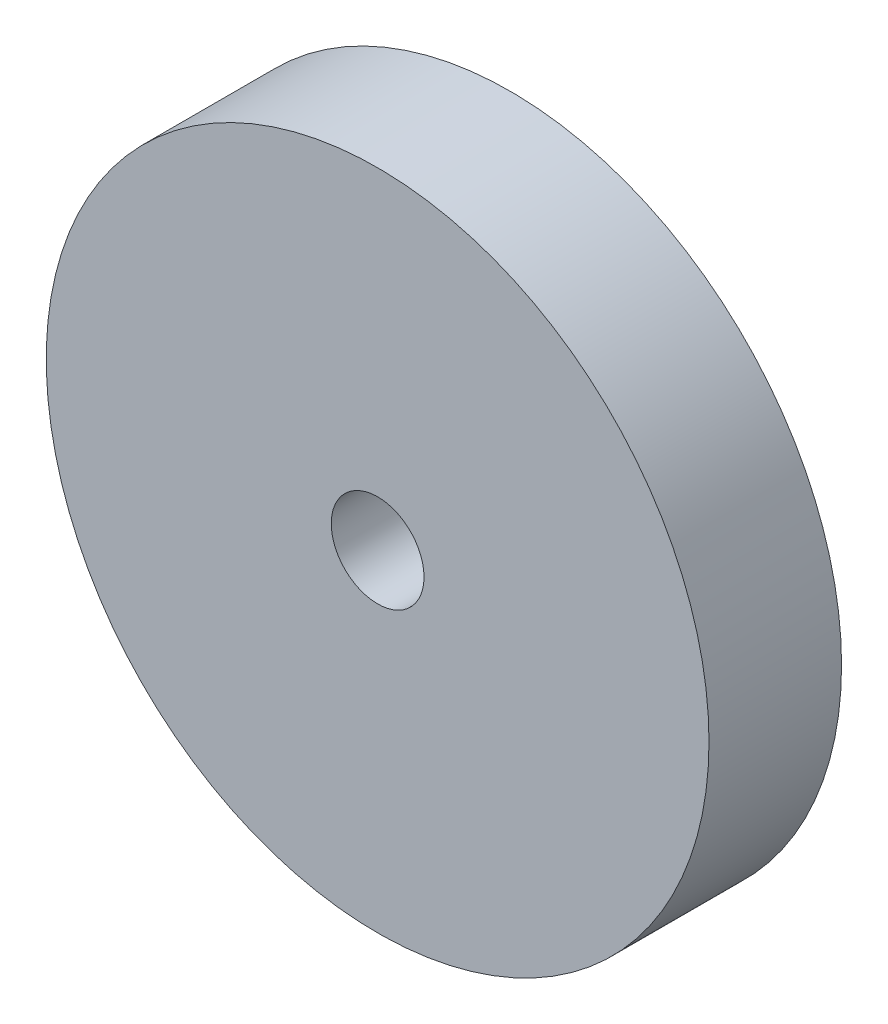
ISO-10303-21;
HEADER;
FILE_DESCRIPTION(('STEP AP214'),'2;1');
FILE_NAME('part.step','',(''),(''),'','','');
FILE_SCHEMA(('AUTOMOTIVE_DESIGN { 1 0 10303 214 1 1 1 1 }'));
ENDSEC;
DATA;
#1=APPLICATION_CONTEXT('core data for automotive mechanical design processes');
#2=APPLICATION_PROTOCOL_DEFINITION('international standard','automotive_design',2000,#1);
#3=PRODUCT_CONTEXT('',#1,'mechanical');
#4=PRODUCT('Part','Part','',(#3));
#5=PRODUCT_RELATED_PRODUCT_CATEGORY('part','',(#4));
#6=PRODUCT_DEFINITION_FORMATION('','',#4);
#7=PRODUCT_DEFINITION_CONTEXT('part definition',#1,'design');
#8=PRODUCT_DEFINITION('design','',#6,#7);
#9=PRODUCT_DEFINITION_SHAPE('','',#8);
#10=(LENGTH_UNIT() NAMED_UNIT(*) SI_UNIT(.MILLI.,.METRE.));
#11=(NAMED_UNIT(*) PLANE_ANGLE_UNIT() SI_UNIT($,.RADIAN.));
#12=(NAMED_UNIT(*) SI_UNIT($,.STERADIAN.) SOLID_ANGLE_UNIT());
#13=UNCERTAINTY_MEASURE_WITH_UNIT(LENGTH_MEASURE(1.E-05),#10,'distance_accuracy_value','');
#14=(GEOMETRIC_REPRESENTATION_CONTEXT(3) GLOBAL_UNCERTAINTY_ASSIGNED_CONTEXT((#13)) GLOBAL_UNIT_ASSIGNED_CONTEXT((#10,
#11,#12)) REPRESENTATION_CONTEXT('',''));
#15=CARTESIAN_POINT('',(0.,0.,0.));
#16=DIRECTION('',(0.,0.,1.));
#17=DIRECTION('',(1.,0.,0.));
#18=AXIS2_PLACEMENT_3D('',#15,#16,#17);
#19=CARTESIAN_POINT('',(0.,0.,1.));
#20=DIRECTION('',(0.,0.,1.));
#21=DIRECTION('',(1.,0.,0.));
#22=AXIS2_PLACEMENT_3D('',#19,#20,#21);
#23=PLANE('',#22);
#24=CARTESIAN_POINT('',(0.,0.,1.));
#25=DIRECTION('',(0.,0.,1.));
#26=DIRECTION('',(1.,0.,0.));
#27=AXIS2_PLACEMENT_3D('',#24,#25,#26);
#28=CIRCLE('',#27,2.5);
#29=CARTESIAN_POINT('',(2.5,0.,1.));
#30=VERTEX_POINT('',#29);
#31=EDGE_CURVE('E10',#30,#30,#28,.T.);
#32=ORIENTED_EDGE('',*,*,#31,.T.);
#33=EDGE_LOOP('',(#32));
#34=FACE_BOUND('',#33,.T.);
#35=CARTESIAN_POINT('',(0.,0.,1.));
#36=DIRECTION('',(0.,0.,1.));
#37=DIRECTION('',(1.,0.,0.));
#38=AXIS2_PLACEMENT_3D('',#35,#36,#37);
#39=CIRCLE('',#38,0.35);
#40=CARTESIAN_POINT('',(0.35,0.,1.));
#41=VERTEX_POINT('',#40);
#42=EDGE_CURVE('E46',#41,#41,#39,.T.);
#43=ORIENTED_EDGE('',*,*,#42,.F.);
#44=EDGE_LOOP('',(#43));
#45=FACE_BOUND('',#44,.T.);
#46=ADVANCED_FACE('F35',(#34,#45),#23,.T.);
#47=CARTESIAN_POINT('',(0.,0.,0.));
#48=DIRECTION('',(0.,0.,1.));
#49=DIRECTION('',(1.,0.,0.));
#50=AXIS2_PLACEMENT_3D('',#47,#48,#49);
#51=PLANE('',#50);
#52=CARTESIAN_POINT('',(0.,0.,0.));
#53=DIRECTION('',(0.,0.,1.));
#54=DIRECTION('',(1.,0.,0.));
#55=AXIS2_PLACEMENT_3D('',#52,#53,#54);
#56=CIRCLE('',#55,2.5);
#57=CARTESIAN_POINT('',(2.5,0.,0.));
#58=VERTEX_POINT('',#57);
#59=EDGE_CURVE('E39',#58,#58,#56,.T.);
#60=ORIENTED_EDGE('',*,*,#59,.F.);
#61=EDGE_LOOP('',(#60));
#62=FACE_BOUND('',#61,.T.);
#63=CARTESIAN_POINT('',(0.,0.,0.));
#64=DIRECTION('',(0.,0.,1.));
#65=DIRECTION('',(1.,0.,0.));
#66=AXIS2_PLACEMENT_3D('',#63,#64,#65);
#67=CIRCLE('',#66,0.35);
#68=CARTESIAN_POINT('',(0.35,0.,0.));
#69=VERTEX_POINT('',#68);
#70=EDGE_CURVE('E48',#69,#69,#67,.T.);
#71=ORIENTED_EDGE('',*,*,#70,.T.);
#72=EDGE_LOOP('',(#71));
#73=FACE_BOUND('',#72,.T.);
#74=ADVANCED_FACE('F58',(#62,#73),#51,.F.);
#75=CARTESIAN_POINT('',(0.,0.,1.));
#76=DIRECTION('',(0.,0.,-1.));
#77=DIRECTION('',(-1.,0.,0.));
#78=AXIS2_PLACEMENT_3D('',#75,#76,#77);
#79=CYLINDRICAL_SURFACE('',#78,2.5);
#80=ORIENTED_EDGE('',*,*,#31,.F.);
#81=EDGE_LOOP('',(#80));
#82=FACE_BOUND('',#81,.T.);
#83=ORIENTED_EDGE('',*,*,#59,.T.);
#84=EDGE_LOOP('',(#83));
#85=FACE_BOUND('',#84,.T.);
#86=ADVANCED_FACE('F37',(#82,#85),#79,.T.);
#87=CARTESIAN_POINT('',(0.,0.,1.));
#88=DIRECTION('',(0.,0.,-1.));
#89=DIRECTION('',(-1.,0.,0.));
#90=AXIS2_PLACEMENT_3D('',#87,#88,#89);
#91=CYLINDRICAL_SURFACE('',#90,0.35);
#92=ORIENTED_EDGE('',*,*,#42,.T.);
#93=EDGE_LOOP('',(#92));
#94=FACE_BOUND('',#93,.T.);
#95=ORIENTED_EDGE('',*,*,#70,.F.);
#96=EDGE_LOOP('',(#95));
#97=FACE_BOUND('',#96,.T.);
#98=ADVANCED_FACE('F54',(#94,#97),#91,.F.);
#99=CLOSED_SHELL('',(#46,#74,#86,#98));
#100=MANIFOLD_SOLID_BREP('B2',#99);
#101=ADVANCED_BREP_SHAPE_REPRESENTATION('',(#18,#100),#14);
#102=SHAPE_DEFINITION_REPRESENTATION(#9,#101);
ENDSEC;
END-ISO-10303-21;
